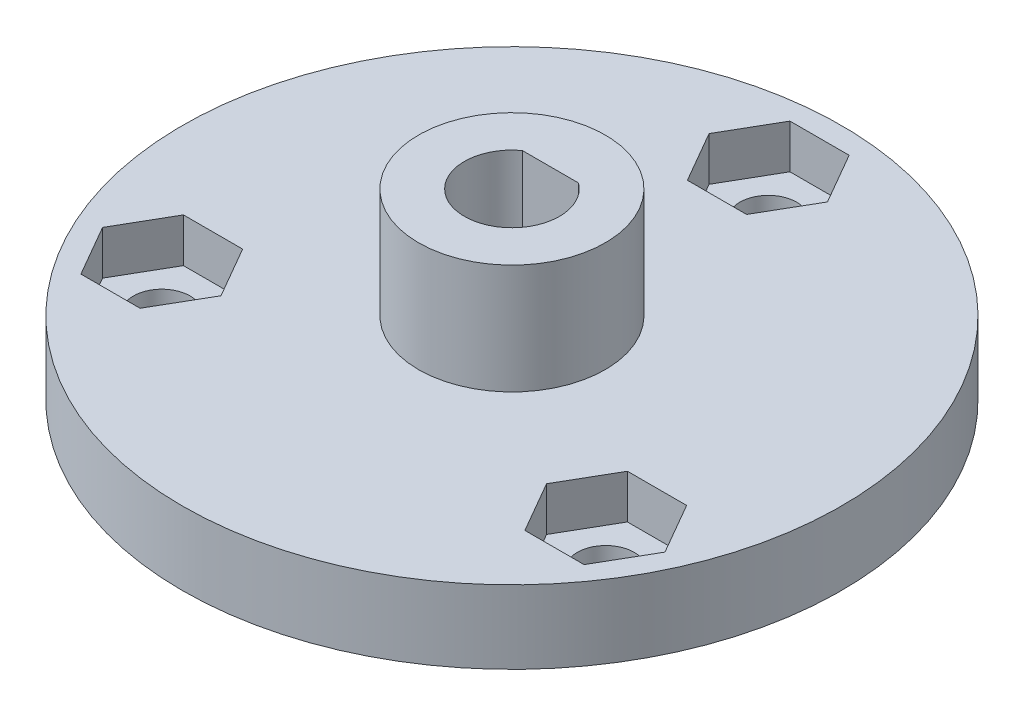
ISO-10303-21;
HEADER;
FILE_DESCRIPTION(('STEP AP214'),'2;1');
FILE_NAME('part.step','',(''),(''),'','','');
FILE_SCHEMA(('AUTOMOTIVE_DESIGN { 1 0 10303 214 1 1 1 1 }'));
ENDSEC;
DATA;
#1=APPLICATION_CONTEXT('core data for automotive mechanical design processes');
#2=APPLICATION_PROTOCOL_DEFINITION('international standard','automotive_design',2000,#1);
#3=PRODUCT_CONTEXT('',#1,'mechanical');
#4=PRODUCT('Part','Part','',(#3));
#5=PRODUCT_RELATED_PRODUCT_CATEGORY('part','',(#4));
#6=PRODUCT_DEFINITION_FORMATION('','',#4);
#7=PRODUCT_DEFINITION_CONTEXT('part definition',#1,'design');
#8=PRODUCT_DEFINITION('design','',#6,#7);
#9=PRODUCT_DEFINITION_SHAPE('','',#8);
#10=(LENGTH_UNIT() NAMED_UNIT(*) SI_UNIT(.MILLI.,.METRE.));
#11=(NAMED_UNIT(*) PLANE_ANGLE_UNIT() SI_UNIT($,.RADIAN.));
#12=(NAMED_UNIT(*) SI_UNIT($,.STERADIAN.) SOLID_ANGLE_UNIT());
#13=UNCERTAINTY_MEASURE_WITH_UNIT(LENGTH_MEASURE(1.E-05),#10,'distance_accuracy_value','');
#14=(GEOMETRIC_REPRESENTATION_CONTEXT(3) GLOBAL_UNCERTAINTY_ASSIGNED_CONTEXT((#13)) GLOBAL_UNIT_ASSIGNED_CONTEXT((#10,
#11,#12)) REPRESENTATION_CONTEXT('',''));
#15=CARTESIAN_POINT('',(0.,0.,0.));
#16=DIRECTION('',(0.,0.,1.));
#17=DIRECTION('',(1.,0.,0.));
#18=AXIS2_PLACEMENT_3D('',#15,#16,#17);
#19=CARTESIAN_POINT('',(0.,4.,0.));
#20=DIRECTION('',(0.,1.,0.));
#21=DIRECTION('',(0.,0.,1.));
#22=AXIS2_PLACEMENT_3D('',#19,#20,#21);
#23=PLANE('',#22);
#24=DIRECTION('',(1.,0.,0.));
#25=VECTOR('',#24,1.);
#26=CARTESIAN_POINT('',(-13.7409364067131,4.,4.20000000000006));
#27=LINE('',#26,#25);
#28=CARTESIAN_POINT('',(-13.7409364067131,4.,4.20000000000006));
#29=VERTEX_POINT('',#28);
#30=CARTESIAN_POINT('',(-10.5077748992512,4.,4.20000000000006));
#31=VERTEX_POINT('',#30);
#32=EDGE_CURVE('E226',#29,#31,#27,.T.);
#33=ORIENTED_EDGE('',*,*,#32,.T.);
#34=DIRECTION('',(0.499999999999999,0.,0.866025403784439));
#35=VECTOR('',#34,1.);
#36=CARTESIAN_POINT('',(-10.5077748992512,4.,4.20000000000006));
#37=LINE('',#36,#35);
#38=CARTESIAN_POINT('',(-8.8911941455202,4.,7.00000000000006));
#39=VERTEX_POINT('',#38);
#40=EDGE_CURVE('E63',#31,#39,#37,.T.);
#41=ORIENTED_EDGE('',*,*,#40,.T.);
#42=DIRECTION('',(-0.5,0.,0.866025403784438));
#43=VECTOR('',#42,1.);
#44=CARTESIAN_POINT('',(-8.8911941455202,4.,7.00000000000006));
#45=LINE('',#44,#43);
#46=CARTESIAN_POINT('',(-10.5077748992512,4.,9.80000000000006));
#47=VERTEX_POINT('',#46);
#48=EDGE_CURVE('E244',#39,#47,#45,.T.);
#49=ORIENTED_EDGE('',*,*,#48,.T.);
#50=DIRECTION('',(-1.,0.,0.));
#51=VECTOR('',#50,1.);
#52=CARTESIAN_POINT('',(-10.5077748992512,4.,9.80000000000006));
#53=LINE('',#52,#51);
#54=CARTESIAN_POINT('',(-13.7409364067131,4.,9.80000000000006));
#55=VERTEX_POINT('',#54);
#56=EDGE_CURVE('E248',#47,#55,#53,.T.);
#57=ORIENTED_EDGE('',*,*,#56,.T.);
#58=DIRECTION('',(-0.499999999999999,0.,-0.866025403784439));
#59=VECTOR('',#58,1.);
#60=CARTESIAN_POINT('',(-13.7409364067131,4.,9.80000000000006));
#61=LINE('',#60,#59);
#62=CARTESIAN_POINT('',(-15.357517160444,4.,7.00000000000006));
#63=VERTEX_POINT('',#62);
#64=EDGE_CURVE('E252',#55,#63,#61,.T.);
#65=ORIENTED_EDGE('',*,*,#64,.T.);
#66=DIRECTION('',(0.5,0.,-0.866025403784439));
#67=VECTOR('',#66,1.);
#68=CARTESIAN_POINT('',(-15.357517160444,4.,7.00000000000006));
#69=LINE('',#68,#67);
#70=EDGE_CURVE('E256',#63,#29,#69,.T.);
#71=ORIENTED_EDGE('',*,*,#70,.T.);
#72=EDGE_LOOP('',(#33,#41,#49,#57,#65,#71));
#73=FACE_BOUND('',#72,.T.);
#74=CARTESIAN_POINT('',(0.,4.,0.));
#75=DIRECTION('',(0.,1.,0.));
#76=DIRECTION('',(0.,0.,1.));
#77=AXIS2_PLACEMENT_3D('',#74,#75,#76);
#78=CIRCLE('',#77,5.1);
#79=CARTESIAN_POINT('',(0.,4.,5.1));
#80=VERTEX_POINT('',#79);
#81=EDGE_CURVE('E350',#80,#80,#78,.T.);
#82=ORIENTED_EDGE('',*,*,#81,.F.);
#83=EDGE_LOOP('',(#82));
#84=FACE_BOUND('',#83,.T.);
#85=CARTESIAN_POINT('',(0.,4.,0.));
#86=DIRECTION('',(0.,1.,0.));
#87=DIRECTION('',(0.,0.,1.));
#88=AXIS2_PLACEMENT_3D('',#85,#86,#87);
#89=CIRCLE('',#88,18.);
#90=CARTESIAN_POINT('',(0.,4.,18.));
#91=VERTEX_POINT('',#90);
#92=EDGE_CURVE('E11',#91,#91,#89,.T.);
#93=ORIENTED_EDGE('',*,*,#92,.T.);
#94=EDGE_LOOP('',(#93));
#95=FACE_BOUND('',#94,.T.);
#96=DIRECTION('',(-0.5,0.,-0.866025403784439));
#97=VECTOR('',#96,1.);
#98=CARTESIAN_POINT('',(10.5077748992512,4.,9.79999999999994));
#99=LINE('',#98,#97);
#100=CARTESIAN_POINT('',(10.5077748992512,4.,9.79999999999994));
#101=VERTEX_POINT('',#100);
#102=CARTESIAN_POINT('',(8.89119414552027,4.,6.99999999999994));
#103=VERTEX_POINT('',#102);
#104=EDGE_CURVE('E291',#101,#103,#99,.T.);
#105=ORIENTED_EDGE('',*,*,#104,.T.);
#106=DIRECTION('',(0.500000000000001,0.,-0.866025403784438));
#107=VECTOR('',#106,1.);
#108=CARTESIAN_POINT('',(8.89119414552027,4.,6.99999999999994));
#109=LINE('',#108,#107);
#110=CARTESIAN_POINT('',(10.5077748992512,4.,4.19999999999994));
#111=VERTEX_POINT('',#110);
#112=EDGE_CURVE('E285',#103,#111,#109,.T.);
#113=ORIENTED_EDGE('',*,*,#112,.T.);
#114=DIRECTION('',(1.,0.,0.));
#115=VECTOR('',#114,1.);
#116=CARTESIAN_POINT('',(10.5077748992512,4.,4.19999999999994));
#117=LINE('',#116,#115);
#118=CARTESIAN_POINT('',(13.7409364067131,4.,4.19999999999995));
#119=VERTEX_POINT('',#118);
#120=EDGE_CURVE('E310',#111,#119,#117,.T.);
#121=ORIENTED_EDGE('',*,*,#120,.T.);
#122=DIRECTION('',(0.499999999999999,0.,0.866025403784439));
#123=VECTOR('',#122,1.);
#124=CARTESIAN_POINT('',(13.7409364067131,4.,4.19999999999995));
#125=LINE('',#124,#123);
#126=CARTESIAN_POINT('',(15.3575171604441,4.,6.99999999999995));
#127=VERTEX_POINT('',#126);
#128=EDGE_CURVE('E314',#119,#127,#125,.T.);
#129=ORIENTED_EDGE('',*,*,#128,.T.);
#130=DIRECTION('',(-0.500000000000001,0.,0.866025403784438));
#131=VECTOR('',#130,1.);
#132=CARTESIAN_POINT('',(15.3575171604441,4.,6.99999999999995));
#133=LINE('',#132,#131);
#134=CARTESIAN_POINT('',(13.7409364067131,4.,9.79999999999995));
#135=VERTEX_POINT('',#134);
#136=EDGE_CURVE('E318',#127,#135,#133,.T.);
#137=ORIENTED_EDGE('',*,*,#136,.T.);
#138=DIRECTION('',(-1.,0.,0.));
#139=VECTOR('',#138,1.);
#140=CARTESIAN_POINT('',(13.7409364067131,4.,9.79999999999995));
#141=LINE('',#140,#139);
#142=EDGE_CURVE('E322',#135,#101,#141,.T.);
#143=ORIENTED_EDGE('',*,*,#142,.T.);
#144=EDGE_LOOP('',(#105,#113,#121,#129,#137,#143));
#145=FACE_BOUND('',#144,.T.);
#146=DIRECTION('',(-0.5,0.,0.866025403784438));
#147=VECTOR('',#146,1.);
#148=CARTESIAN_POINT('',(3.23316150746183,4.,-14.));
#149=LINE('',#148,#147);
#150=CARTESIAN_POINT('',(3.23316150746183,4.,-14.));
#151=VERTEX_POINT('',#150);
#152=CARTESIAN_POINT('',(1.61658075373088,4.,-11.2));
#153=VERTEX_POINT('',#152);
#154=EDGE_CURVE('E198',#151,#153,#149,.T.);
#155=ORIENTED_EDGE('',*,*,#154,.T.);
#156=DIRECTION('',(-1.,0.,0.));
#157=VECTOR('',#156,1.);
#158=CARTESIAN_POINT('',(1.61658075373088,4.,-11.2));
#159=LINE('',#158,#157);
#160=CARTESIAN_POINT('',(-1.61658075373102,4.,-11.2));
#161=VERTEX_POINT('',#160);
#162=EDGE_CURVE('E55',#153,#161,#159,.T.);
#163=ORIENTED_EDGE('',*,*,#162,.T.);
#164=DIRECTION('',(-0.5,0.,-0.866025403784439));
#165=VECTOR('',#164,1.);
#166=CARTESIAN_POINT('',(-1.61658075373102,4.,-11.2));
#167=LINE('',#166,#165);
#168=CARTESIAN_POINT('',(-3.23316150746197,4.,-14.));
#169=VERTEX_POINT('',#168);
#170=EDGE_CURVE('E202',#161,#169,#167,.T.);
#171=ORIENTED_EDGE('',*,*,#170,.T.);
#172=DIRECTION('',(0.5,0.,-0.866025403784439));
#173=VECTOR('',#172,1.);
#174=CARTESIAN_POINT('',(-3.23316150746197,4.,-14.));
#175=LINE('',#174,#173);
#176=CARTESIAN_POINT('',(-1.61658075373102,4.,-16.8));
#177=VERTEX_POINT('',#176);
#178=EDGE_CURVE('E751',#169,#177,#175,.T.);
#179=ORIENTED_EDGE('',*,*,#178,.T.);
#180=DIRECTION('',(1.,0.,0.));
#181=VECTOR('',#180,1.);
#182=CARTESIAN_POINT('',(-1.61658075373102,4.,-16.8));
#183=LINE('',#182,#181);
#184=CARTESIAN_POINT('',(1.61658075373088,4.,-16.8));
#185=VERTEX_POINT('',#184);
#186=EDGE_CURVE('E746',#177,#185,#183,.T.);
#187=ORIENTED_EDGE('',*,*,#186,.T.);
#188=DIRECTION('',(0.5,0.,0.866025403784439));
#189=VECTOR('',#188,1.);
#190=CARTESIAN_POINT('',(1.61658075373088,4.,-16.8));
#191=LINE('',#190,#189);
#192=EDGE_CURVE('E736',#185,#151,#191,.T.);
#193=ORIENTED_EDGE('',*,*,#192,.T.);
#194=EDGE_LOOP('',(#155,#163,#171,#179,#187,#193));
#195=FACE_BOUND('',#194,.T.);
#196=ADVANCED_FACE('F39',(#73,#84,#95,#145,#195),#23,.T.);
#197=CARTESIAN_POINT('',(0.,0.,0.));
#198=DIRECTION('',(0.,1.,0.));
#199=DIRECTION('',(0.,0.,1.));
#200=AXIS2_PLACEMENT_3D('',#197,#198,#199);
#201=PLANE('',#200);
#202=CARTESIAN_POINT('',(0.,0.,0.));
#203=DIRECTION('',(0.,-1.,0.));
#204=DIRECTION('',(0.,0.,-1.));
#205=AXIS2_PLACEMENT_3D('',#202,#203,#204);
#206=CIRCLE('',#205,2.6);
#207=CARTESIAN_POINT('',(0.,0.,-2.6));
#208=VERTEX_POINT('',#207);
#209=EDGE_CURVE('E366',#208,#208,#206,.T.);
#210=ORIENTED_EDGE('',*,*,#209,.F.);
#211=EDGE_LOOP('',(#210));
#212=FACE_BOUND('',#211,.T.);
#213=CARTESIAN_POINT('',(0.,0.,0.));
#214=DIRECTION('',(0.,1.,0.));
#215=DIRECTION('',(0.,0.,1.));
#216=AXIS2_PLACEMENT_3D('',#213,#214,#215);
#217=CIRCLE('',#216,18.);
#218=CARTESIAN_POINT('',(0.,0.,18.));
#219=VERTEX_POINT('',#218);
#220=EDGE_CURVE('E43',#219,#219,#217,.T.);
#221=ORIENTED_EDGE('',*,*,#220,.F.);
#222=EDGE_LOOP('',(#221));
#223=FACE_BOUND('',#222,.T.);
#224=CARTESIAN_POINT('',(-12.1243556529821,0.,7.00000000000006));
#225=DIRECTION('',(0.,1.,0.));
#226=DIRECTION('',(0.,0.,1.));
#227=AXIS2_PLACEMENT_3D('',#224,#225,#226);
#228=CIRCLE('',#227,1.55);
#229=CARTESIAN_POINT('',(-12.1243556529821,0.,8.55000000000006));
#230=VERTEX_POINT('',#229);
#231=EDGE_CURVE('E384',#230,#230,#228,.T.);
#232=ORIENTED_EDGE('',*,*,#231,.T.);
#233=EDGE_LOOP('',(#232));
#234=FACE_BOUND('',#233,.T.);
#235=CARTESIAN_POINT('',(0.,0.,-14.));
#236=DIRECTION('',(0.,1.,0.));
#237=DIRECTION('',(0.,0.,1.));
#238=AXIS2_PLACEMENT_3D('',#235,#236,#237);
#239=CIRCLE('',#238,1.55);
#240=CARTESIAN_POINT('',(0.,0.,-12.45));
#241=VERTEX_POINT('',#240);
#242=EDGE_CURVE('E380',#241,#241,#239,.T.);
#243=ORIENTED_EDGE('',*,*,#242,.T.);
#244=EDGE_LOOP('',(#243));
#245=FACE_BOUND('',#244,.T.);
#246=CARTESIAN_POINT('',(12.1243556529822,0.,6.99999999999994));
#247=DIRECTION('',(0.,1.,0.));
#248=DIRECTION('',(0.,0.,1.));
#249=AXIS2_PLACEMENT_3D('',#246,#247,#248);
#250=CIRCLE('',#249,1.55);
#251=CARTESIAN_POINT('',(12.1243556529822,0.,8.54999999999994));
#252=VERTEX_POINT('',#251);
#253=EDGE_CURVE('E373',#252,#252,#250,.T.);
#254=ORIENTED_EDGE('',*,*,#253,.T.);
#255=EDGE_LOOP('',(#254));
#256=FACE_BOUND('',#255,.T.);
#257=ADVANCED_FACE('F394',(#212,#223,#234,#245,#256),#201,.F.);
#258=CARTESIAN_POINT('',(0.,4.,0.));
#259=DIRECTION('',(0.,-1.,0.));
#260=DIRECTION('',(0.,0.,-1.));
#261=AXIS2_PLACEMENT_3D('',#258,#259,#260);
#262=CYLINDRICAL_SURFACE('',#261,18.);
#263=ORIENTED_EDGE('',*,*,#92,.F.);
#264=EDGE_LOOP('',(#263));
#265=FACE_BOUND('',#264,.T.);
#266=ORIENTED_EDGE('',*,*,#220,.T.);
#267=EDGE_LOOP('',(#266));
#268=FACE_BOUND('',#267,.T.);
#269=ADVANCED_FACE('F41',(#265,#268),#262,.T.);
#270=CARTESIAN_POINT('',(-12.1243556529821,4.,7.00000000000006));
#271=DIRECTION('',(0.,-1.,0.));
#272=DIRECTION('',(0.,0.,-1.));
#273=AXIS2_PLACEMENT_3D('',#270,#271,#272);
#274=CYLINDRICAL_SURFACE('',#273,1.55);
#275=CARTESIAN_POINT('',(-12.1243556529821,1.6,7.00000000000006));
#276=DIRECTION('',(0.,-1.,0.));
#277=DIRECTION('',(0.,0.,-1.));
#278=AXIS2_PLACEMENT_3D('',#275,#276,#277);
#279=CIRCLE('',#278,1.55);
#280=CARTESIAN_POINT('',(-12.1243556529821,1.6,5.45000000000006));
#281=VERTEX_POINT('',#280);
#282=EDGE_CURVE('E216',#281,#281,#279,.T.);
#283=ORIENTED_EDGE('',*,*,#282,.F.);
#284=EDGE_LOOP('',(#283));
#285=FACE_BOUND('',#284,.T.);
#286=ORIENTED_EDGE('',*,*,#231,.F.);
#287=EDGE_LOOP('',(#286));
#288=FACE_BOUND('',#287,.T.);
#289=ADVANCED_FACE('F415',(#285,#288),#274,.F.);
#290=CARTESIAN_POINT('',(0.,4.,-14.));
#291=DIRECTION('',(0.,-1.,0.));
#292=DIRECTION('',(0.,0.,-1.));
#293=AXIS2_PLACEMENT_3D('',#290,#291,#292);
#294=CYLINDRICAL_SURFACE('',#293,1.55);
#295=CARTESIAN_POINT('',(0.,1.6,-14.));
#296=DIRECTION('',(0.,-1.,0.));
#297=DIRECTION('',(0.,0.,-1.));
#298=AXIS2_PLACEMENT_3D('',#295,#296,#297);
#299=CIRCLE('',#298,1.55);
#300=CARTESIAN_POINT('',(0.,1.6,-15.55));
#301=VERTEX_POINT('',#300);
#302=EDGE_CURVE('E280',#301,#301,#299,.T.);
#303=ORIENTED_EDGE('',*,*,#302,.F.);
#304=EDGE_LOOP('',(#303));
#305=FACE_BOUND('',#304,.T.);
#306=ORIENTED_EDGE('',*,*,#242,.F.);
#307=EDGE_LOOP('',(#306));
#308=FACE_BOUND('',#307,.T.);
#309=ADVANCED_FACE('F405',(#305,#308),#294,.F.);
#310=CARTESIAN_POINT('',(12.1243556529822,4.,6.99999999999994));
#311=DIRECTION('',(0.,-1.,0.));
#312=DIRECTION('',(0.,0.,-1.));
#313=AXIS2_PLACEMENT_3D('',#310,#311,#312);
#314=CYLINDRICAL_SURFACE('',#313,1.55);
#315=CARTESIAN_POINT('',(12.1243556529822,1.6,6.99999999999994));
#316=DIRECTION('',(0.,-1.,0.));
#317=DIRECTION('',(0.,0.,-1.));
#318=AXIS2_PLACEMENT_3D('',#315,#316,#317);
#319=CIRCLE('',#318,1.55);
#320=CARTESIAN_POINT('',(12.1243556529822,1.6,5.44999999999993));
#321=VERTEX_POINT('',#320);
#322=EDGE_CURVE('E281',#321,#321,#319,.T.);
#323=ORIENTED_EDGE('',*,*,#322,.F.);
#324=EDGE_LOOP('',(#323));
#325=FACE_BOUND('',#324,.T.);
#326=ORIENTED_EDGE('',*,*,#253,.F.);
#327=EDGE_LOOP('',(#326));
#328=FACE_BOUND('',#327,.T.);
#329=ADVANCED_FACE('F402',(#325,#328),#314,.F.);
#330=CARTESIAN_POINT('',(0.,2.,0.));
#331=DIRECTION('',(0.,-1.,0.));
#332=DIRECTION('',(0.,0.,-1.));
#333=AXIS2_PLACEMENT_3D('',#330,#331,#332);
#334=CYLINDRICAL_SURFACE('',#333,2.6);
#335=CARTESIAN_POINT('',(0.,2.,0.));
#336=DIRECTION('',(0.,-1.,0.));
#337=DIRECTION('',(0.,0.,-1.));
#338=AXIS2_PLACEMENT_3D('',#335,#336,#337);
#339=CIRCLE('',#338,2.6);
#340=CARTESIAN_POINT('',(-1.53297097167559,2.,-2.1));
#341=VERTEX_POINT('',#340);
#342=CARTESIAN_POINT('',(1.53297097167559,2.,-2.1));
#343=VERTEX_POINT('',#342);
#344=EDGE_CURVE('E369',#341,#343,#339,.T.);
#345=ORIENTED_EDGE('',*,*,#344,.F.);
#346=DIRECTION('',(0.,-1.,0.));
#347=VECTOR('',#346,1.);
#348=CARTESIAN_POINT('',(-1.53297097167559,4.,-2.1));
#349=LINE('',#348,#347);
#350=CARTESIAN_POINT('',(-1.53297097167559,10.,-2.1));
#351=VERTEX_POINT('',#350);
#352=EDGE_CURVE('E362',#351,#341,#349,.T.);
#353=ORIENTED_EDGE('',*,*,#352,.F.);
#354=CARTESIAN_POINT('',(0.,10.,0.));
#355=DIRECTION('',(0.,1.,0.));
#356=DIRECTION('',(0.,0.,1.));
#357=AXIS2_PLACEMENT_3D('',#354,#355,#356);
#358=CIRCLE('',#357,2.6);
#359=CARTESIAN_POINT('',(1.53297097167559,10.,-2.1));
#360=VERTEX_POINT('',#359);
#361=EDGE_CURVE('E204',#351,#360,#358,.T.);
#362=ORIENTED_EDGE('',*,*,#361,.T.);
#363=DIRECTION('',(0.,-1.,0.));
#364=VECTOR('',#363,1.);
#365=CARTESIAN_POINT('',(1.53297097167559,4.,-2.1));
#366=LINE('',#365,#364);
#367=EDGE_CURVE('E363',#360,#343,#366,.T.);
#368=ORIENTED_EDGE('',*,*,#367,.T.);
#369=EDGE_LOOP('',(#345,#353,#362,#368));
#370=FACE_BOUND('',#369,.T.);
#371=ORIENTED_EDGE('',*,*,#209,.T.);
#372=EDGE_LOOP('',(#371));
#373=FACE_BOUND('',#372,.T.);
#374=ADVANCED_FACE('F404',(#370,#373),#334,.F.);
#375=CARTESIAN_POINT('',(0.,2.,0.));
#376=DIRECTION('',(0.,-1.,0.));
#377=DIRECTION('',(0.,0.,-1.));
#378=AXIS2_PLACEMENT_3D('',#375,#376,#377);
#379=PLANE('',#378);
#380=DIRECTION('',(1.,0.,0.));
#381=VECTOR('',#380,1.);
#382=CARTESIAN_POINT('',(0.,2.,-2.1));
#383=LINE('',#382,#381);
#384=EDGE_CURVE('E355',#341,#343,#383,.T.);
#385=ORIENTED_EDGE('',*,*,#384,.F.);
#386=ORIENTED_EDGE('',*,*,#344,.T.);
#387=EDGE_LOOP('',(#385,#386));
#388=FACE_BOUND('',#387,.T.);
#389=ADVANCED_FACE('F412',(#388),#379,.T.);
#390=CARTESIAN_POINT('',(0.,4.,-2.1));
#391=DIRECTION('',(0.,0.,-1.));
#392=DIRECTION('',(-1.,0.,0.));
#393=AXIS2_PLACEMENT_3D('',#390,#391,#392);
#394=PLANE('',#393);
#395=ORIENTED_EDGE('',*,*,#384,.T.);
#396=ORIENTED_EDGE('',*,*,#367,.F.);
#397=DIRECTION('',(-1.,0.,0.));
#398=VECTOR('',#397,1.);
#399=CARTESIAN_POINT('',(-1.53297097167559,10.,-2.1));
#400=LINE('',#399,#398);
#401=EDGE_CURVE('E210',#360,#351,#400,.T.);
#402=ORIENTED_EDGE('',*,*,#401,.T.);
#403=ORIENTED_EDGE('',*,*,#352,.T.);
#404=EDGE_LOOP('',(#395,#396,#402,#403));
#405=FACE_BOUND('',#404,.T.);
#406=ADVANCED_FACE('F505',(#405),#394,.F.);
#407=CARTESIAN_POINT('',(0.,10.,0.));
#408=DIRECTION('',(0.,1.,0.));
#409=DIRECTION('',(0.,0.,1.));
#410=AXIS2_PLACEMENT_3D('',#407,#408,#409);
#411=PLANE('',#410);
#412=CARTESIAN_POINT('',(0.,10.,0.));
#413=DIRECTION('',(0.,1.,0.));
#414=DIRECTION('',(0.,0.,1.));
#415=AXIS2_PLACEMENT_3D('',#412,#413,#414);
#416=CIRCLE('',#415,5.1);
#417=CARTESIAN_POINT('',(0.,10.,5.1));
#418=VERTEX_POINT('',#417);
#419=EDGE_CURVE('E351',#418,#418,#416,.T.);
#420=ORIENTED_EDGE('',*,*,#419,.T.);
#421=EDGE_LOOP('',(#420));
#422=FACE_BOUND('',#421,.T.);
#423=ORIENTED_EDGE('',*,*,#401,.F.);
#424=ORIENTED_EDGE('',*,*,#361,.F.);
#425=EDGE_LOOP('',(#423,#424));
#426=FACE_BOUND('',#425,.T.);
#427=ADVANCED_FACE('F502',(#422,#426),#411,.T.);
#428=CARTESIAN_POINT('',(0.,10.,0.));
#429=DIRECTION('',(0.,-1.,0.));
#430=DIRECTION('',(0.,0.,-1.));
#431=AXIS2_PLACEMENT_3D('',#428,#429,#430);
#432=CYLINDRICAL_SURFACE('',#431,5.1);
#433=ORIENTED_EDGE('',*,*,#419,.F.);
#434=EDGE_LOOP('',(#433));
#435=FACE_BOUND('',#434,.T.);
#436=ORIENTED_EDGE('',*,*,#81,.T.);
#437=EDGE_LOOP('',(#436));
#438=FACE_BOUND('',#437,.T.);
#439=ADVANCED_FACE('F477',(#435,#438),#432,.T.);
#440=CARTESIAN_POINT('',(0.,1.6,0.));
#441=DIRECTION('',(0.,-1.,0.));
#442=DIRECTION('',(0.,0.,-1.));
#443=AXIS2_PLACEMENT_3D('',#440,#441,#442);
#444=PLANE('',#443);
#445=DIRECTION('',(0.500000000000001,0.,-0.866025403784438));
#446=VECTOR('',#445,1.);
#447=CARTESIAN_POINT('',(8.89119414552027,1.6,6.99999999999994));
#448=LINE('',#447,#446);
#449=CARTESIAN_POINT('',(8.89119414552027,1.6,6.99999999999994));
#450=VERTEX_POINT('',#449);
#451=CARTESIAN_POINT('',(10.5077748992512,1.6,4.19999999999994));
#452=VERTEX_POINT('',#451);
#453=EDGE_CURVE('E286',#450,#452,#448,.T.);
#454=ORIENTED_EDGE('',*,*,#453,.F.);
#455=DIRECTION('',(-0.5,0.,-0.866025403784439));
#456=VECTOR('',#455,1.);
#457=CARTESIAN_POINT('',(10.5077748992512,1.6,9.79999999999994));
#458=LINE('',#457,#456);
#459=CARTESIAN_POINT('',(10.5077748992512,1.6,9.79999999999994));
#460=VERTEX_POINT('',#459);
#461=EDGE_CURVE('E303',#460,#450,#458,.T.);
#462=ORIENTED_EDGE('',*,*,#461,.F.);
#463=DIRECTION('',(-1.,0.,0.));
#464=VECTOR('',#463,1.);
#465=CARTESIAN_POINT('',(13.7409364067131,1.6,9.79999999999995));
#466=LINE('',#465,#464);
#467=CARTESIAN_POINT('',(13.7409364067131,1.6,9.79999999999995));
#468=VERTEX_POINT('',#467);
#469=EDGE_CURVE('E300',#468,#460,#466,.T.);
#470=ORIENTED_EDGE('',*,*,#469,.F.);
#471=DIRECTION('',(-0.500000000000001,0.,0.866025403784438));
#472=VECTOR('',#471,1.);
#473=CARTESIAN_POINT('',(15.3575171604441,1.6,6.99999999999995));
#474=LINE('',#473,#472);
#475=CARTESIAN_POINT('',(15.3575171604441,1.6,6.99999999999995));
#476=VERTEX_POINT('',#475);
#477=EDGE_CURVE('E297',#476,#468,#474,.T.);
#478=ORIENTED_EDGE('',*,*,#477,.F.);
#479=DIRECTION('',(0.499999999999999,0.,0.866025403784439));
#480=VECTOR('',#479,1.);
#481=CARTESIAN_POINT('',(13.7409364067131,1.6,4.19999999999995));
#482=LINE('',#481,#480);
#483=CARTESIAN_POINT('',(13.7409364067131,1.6,4.19999999999995));
#484=VERTEX_POINT('',#483);
#485=EDGE_CURVE('E294',#484,#476,#482,.T.);
#486=ORIENTED_EDGE('',*,*,#485,.F.);
#487=DIRECTION('',(1.,0.,0.));
#488=VECTOR('',#487,1.);
#489=CARTESIAN_POINT('',(10.5077748992512,1.6,4.19999999999994));
#490=LINE('',#489,#488);
#491=EDGE_CURVE('E290',#452,#484,#490,.T.);
#492=ORIENTED_EDGE('',*,*,#491,.F.);
#493=EDGE_LOOP('',(#454,#462,#470,#478,#486,#492));
#494=FACE_BOUND('',#493,.T.);
#495=ORIENTED_EDGE('',*,*,#322,.T.);
#496=EDGE_LOOP('',(#495));
#497=FACE_BOUND('',#496,.T.);
#498=ADVANCED_FACE('F473',(#494,#497),#444,.F.);
#499=CARTESIAN_POINT('',(8.89119414552027,1.6,6.99999999999994));
#500=DIRECTION('',(0.866025403784438,0.,0.500000000000001));
#501=DIRECTION('',(0.500000000000001,0.,-0.866025403784438));
#502=AXIS2_PLACEMENT_3D('',#499,#500,#501);
#503=PLANE('',#502);
#504=ORIENTED_EDGE('',*,*,#112,.F.);
#505=DIRECTION('',(0.,1.,0.));
#506=VECTOR('',#505,1.);
#507=CARTESIAN_POINT('',(8.89119414552027,1.6,6.99999999999994));
#508=LINE('',#507,#506);
#509=EDGE_CURVE('E306',#450,#103,#508,.T.);
#510=ORIENTED_EDGE('',*,*,#509,.F.);
#511=ORIENTED_EDGE('',*,*,#453,.T.);
#512=DIRECTION('',(0.,1.,0.));
#513=VECTOR('',#512,1.);
#514=CARTESIAN_POINT('',(10.5077748992512,1.6,4.19999999999994));
#515=LINE('',#514,#513);
#516=EDGE_CURVE('E220',#452,#111,#515,.T.);
#517=ORIENTED_EDGE('',*,*,#516,.T.);
#518=EDGE_LOOP('',(#504,#510,#511,#517));
#519=FACE_BOUND('',#518,.T.);
#520=ADVANCED_FACE('F476',(#519),#503,.T.);
#521=CARTESIAN_POINT('',(10.5077748992512,1.6,4.19999999999994));
#522=DIRECTION('',(0.,0.,1.));
#523=DIRECTION('',(1.,0.,0.));
#524=AXIS2_PLACEMENT_3D('',#521,#522,#523);
#525=PLANE('',#524);
#526=ORIENTED_EDGE('',*,*,#120,.F.);
#527=ORIENTED_EDGE('',*,*,#516,.F.);
#528=ORIENTED_EDGE('',*,*,#491,.T.);
#529=DIRECTION('',(0.,1.,0.));
#530=VECTOR('',#529,1.);
#531=CARTESIAN_POINT('',(13.7409364067131,1.6,4.19999999999995));
#532=LINE('',#531,#530);
#533=EDGE_CURVE('E341',#484,#119,#532,.T.);
#534=ORIENTED_EDGE('',*,*,#533,.T.);
#535=EDGE_LOOP('',(#526,#527,#528,#534));
#536=FACE_BOUND('',#535,.T.);
#537=ADVANCED_FACE('F494',(#536),#525,.T.);
#538=CARTESIAN_POINT('',(13.7409364067131,1.6,4.19999999999995));
#539=DIRECTION('',(-0.866025403784439,0.,0.499999999999999));
#540=DIRECTION('',(0.5,0.,0.866025403784439));
#541=AXIS2_PLACEMENT_3D('',#538,#539,#540);
#542=PLANE('',#541);
#543=ORIENTED_EDGE('',*,*,#128,.F.);
#544=ORIENTED_EDGE('',*,*,#533,.F.);
#545=ORIENTED_EDGE('',*,*,#485,.T.);
#546=DIRECTION('',(0.,1.,0.));
#547=VECTOR('',#546,1.);
#548=CARTESIAN_POINT('',(15.3575171604441,1.6,6.99999999999995));
#549=LINE('',#548,#547);
#550=EDGE_CURVE('E338',#476,#127,#549,.T.);
#551=ORIENTED_EDGE('',*,*,#550,.T.);
#552=EDGE_LOOP('',(#543,#544,#545,#551));
#553=FACE_BOUND('',#552,.T.);
#554=ADVANCED_FACE('F490',(#553),#542,.T.);
#555=CARTESIAN_POINT('',(15.3575171604441,1.6,6.99999999999995));
#556=DIRECTION('',(-0.866025403784438,0.,-0.500000000000001));
#557=DIRECTION('',(-0.500000000000001,0.,0.866025403784438));
#558=AXIS2_PLACEMENT_3D('',#555,#556,#557);
#559=PLANE('',#558);
#560=ORIENTED_EDGE('',*,*,#136,.F.);
#561=ORIENTED_EDGE('',*,*,#550,.F.);
#562=ORIENTED_EDGE('',*,*,#477,.T.);
#563=DIRECTION('',(0.,1.,0.));
#564=VECTOR('',#563,1.);
#565=CARTESIAN_POINT('',(13.7409364067131,1.6,9.79999999999995));
#566=LINE('',#565,#564);
#567=EDGE_CURVE('E335',#468,#135,#566,.T.);
#568=ORIENTED_EDGE('',*,*,#567,.T.);
#569=EDGE_LOOP('',(#560,#561,#562,#568));
#570=FACE_BOUND('',#569,.T.);
#571=ADVANCED_FACE('F486',(#570),#559,.T.);
#572=CARTESIAN_POINT('',(13.7409364067131,1.6,9.79999999999995));
#573=DIRECTION('',(0.,0.,-1.));
#574=DIRECTION('',(-1.,0.,0.));
#575=AXIS2_PLACEMENT_3D('',#572,#573,#574);
#576=PLANE('',#575);
#577=ORIENTED_EDGE('',*,*,#142,.F.);
#578=ORIENTED_EDGE('',*,*,#567,.F.);
#579=ORIENTED_EDGE('',*,*,#469,.T.);
#580=DIRECTION('',(0.,1.,0.));
#581=VECTOR('',#580,1.);
#582=CARTESIAN_POINT('',(10.5077748992512,1.6,9.79999999999994));
#583=LINE('',#582,#581);
#584=EDGE_CURVE('E332',#460,#101,#583,.T.);
#585=ORIENTED_EDGE('',*,*,#584,.T.);
#586=EDGE_LOOP('',(#577,#578,#579,#585));
#587=FACE_BOUND('',#586,.T.);
#588=ADVANCED_FACE('F482',(#587),#576,.T.);
#589=CARTESIAN_POINT('',(10.5077748992512,1.6,9.79999999999994));
#590=DIRECTION('',(0.866025403784439,0.,-0.499999999999999));
#591=DIRECTION('',(-0.5,0.,-0.866025403784439));
#592=AXIS2_PLACEMENT_3D('',#589,#590,#591);
#593=PLANE('',#592);
#594=ORIENTED_EDGE('',*,*,#104,.F.);
#595=ORIENTED_EDGE('',*,*,#584,.F.);
#596=ORIENTED_EDGE('',*,*,#461,.T.);
#597=ORIENTED_EDGE('',*,*,#509,.T.);
#598=EDGE_LOOP('',(#594,#595,#596,#597));
#599=FACE_BOUND('',#598,.T.);
#600=ADVANCED_FACE('F479',(#599),#593,.T.);
#601=CARTESIAN_POINT('',(0.,1.6,0.));
#602=DIRECTION('',(0.,-1.,0.));
#603=DIRECTION('',(0.,0.,-1.));
#604=AXIS2_PLACEMENT_3D('',#601,#602,#603);
#605=PLANE('',#604);
#606=DIRECTION('',(-1.,0.,0.));
#607=VECTOR('',#606,1.);
#608=CARTESIAN_POINT('',(1.61658075373088,1.6,-11.2));
#609=LINE('',#608,#607);
#610=CARTESIAN_POINT('',(1.61658075373088,1.6,-11.2));
#611=VERTEX_POINT('',#610);
#612=CARTESIAN_POINT('',(-1.61658075373102,1.6,-11.2));
#613=VERTEX_POINT('',#612);
#614=EDGE_CURVE('E186',#611,#613,#609,.T.);
#615=ORIENTED_EDGE('',*,*,#614,.F.);
#616=DIRECTION('',(-0.5,0.,0.866025403784438));
#617=VECTOR('',#616,1.);
#618=CARTESIAN_POINT('',(3.23316150746183,1.6,-14.));
#619=LINE('',#618,#617);
#620=CARTESIAN_POINT('',(3.23316150746183,1.6,-14.));
#621=VERTEX_POINT('',#620);
#622=EDGE_CURVE('E763',#621,#611,#619,.T.);
#623=ORIENTED_EDGE('',*,*,#622,.F.);
#624=DIRECTION('',(0.5,0.,0.866025403784439));
#625=VECTOR('',#624,1.);
#626=CARTESIAN_POINT('',(1.61658075373088,1.6,-16.8));
#627=LINE('',#626,#625);
#628=CARTESIAN_POINT('',(1.61658075373088,1.6,-16.8));
#629=VERTEX_POINT('',#628);
#630=EDGE_CURVE('E769',#629,#621,#627,.T.);
#631=ORIENTED_EDGE('',*,*,#630,.F.);
#632=DIRECTION('',(1.,0.,0.));
#633=VECTOR('',#632,1.);
#634=CARTESIAN_POINT('',(-1.61658075373102,1.6,-16.8));
#635=LINE('',#634,#633);
#636=CARTESIAN_POINT('',(-1.61658075373102,1.6,-16.8));
#637=VERTEX_POINT('',#636);
#638=EDGE_CURVE('E768',#637,#629,#635,.T.);
#639=ORIENTED_EDGE('',*,*,#638,.F.);
#640=DIRECTION('',(0.5,0.,-0.866025403784439));
#641=VECTOR('',#640,1.);
#642=CARTESIAN_POINT('',(-3.23316150746197,1.6,-14.));
#643=LINE('',#642,#641);
#644=CARTESIAN_POINT('',(-3.23316150746197,1.6,-14.));
#645=VERTEX_POINT('',#644);
#646=EDGE_CURVE('E188',#645,#637,#643,.T.);
#647=ORIENTED_EDGE('',*,*,#646,.F.);
#648=DIRECTION('',(-0.5,0.,-0.866025403784439));
#649=VECTOR('',#648,1.);
#650=CARTESIAN_POINT('',(-1.61658075373102,1.6,-11.2));
#651=LINE('',#650,#649);
#652=EDGE_CURVE('E181',#613,#645,#651,.T.);
#653=ORIENTED_EDGE('',*,*,#652,.F.);
#654=EDGE_LOOP('',(#615,#623,#631,#639,#647,#653));
#655=FACE_BOUND('',#654,.T.);
#656=ORIENTED_EDGE('',*,*,#302,.T.);
#657=EDGE_LOOP('',(#656));
#658=FACE_BOUND('',#657,.T.);
#659=ADVANCED_FACE('F183',(#655,#658),#605,.F.);
#660=CARTESIAN_POINT('',(1.61658075373088,1.6,-11.2));
#661=DIRECTION('',(0.,0.,-1.));
#662=DIRECTION('',(-1.,0.,0.));
#663=AXIS2_PLACEMENT_3D('',#660,#661,#662);
#664=PLANE('',#663);
#665=ORIENTED_EDGE('',*,*,#162,.F.);
#666=DIRECTION('',(0.,1.,0.));
#667=VECTOR('',#666,1.);
#668=CARTESIAN_POINT('',(1.61658075373088,1.6,-11.2));
#669=LINE('',#668,#667);
#670=EDGE_CURVE('E196',#611,#153,#669,.T.);
#671=ORIENTED_EDGE('',*,*,#670,.F.);
#672=ORIENTED_EDGE('',*,*,#614,.T.);
#673=DIRECTION('',(0.,1.,0.));
#674=VECTOR('',#673,1.);
#675=CARTESIAN_POINT('',(-1.61658075373102,1.6,-11.2));
#676=LINE('',#675,#674);
#677=EDGE_CURVE('E195',#613,#161,#676,.T.);
#678=ORIENTED_EDGE('',*,*,#677,.T.);
#679=EDGE_LOOP('',(#665,#671,#672,#678));
#680=FACE_BOUND('',#679,.T.);
#681=ADVANCED_FACE('F194',(#680),#664,.T.);
#682=CARTESIAN_POINT('',(-1.61658075373102,1.6,-11.2));
#683=DIRECTION('',(0.866025403784439,0.,-0.5));
#684=DIRECTION('',(-0.5,0.,-0.866025403784439));
#685=AXIS2_PLACEMENT_3D('',#682,#683,#684);
#686=PLANE('',#685);
#687=ORIENTED_EDGE('',*,*,#170,.F.);
#688=ORIENTED_EDGE('',*,*,#677,.F.);
#689=ORIENTED_EDGE('',*,*,#652,.T.);
#690=DIRECTION('',(0.,1.,0.));
#691=VECTOR('',#690,1.);
#692=CARTESIAN_POINT('',(-3.23316150746197,1.6,-14.));
#693=LINE('',#692,#691);
#694=EDGE_CURVE('E205',#645,#169,#693,.T.);
#695=ORIENTED_EDGE('',*,*,#694,.T.);
#696=EDGE_LOOP('',(#687,#688,#689,#695));
#697=FACE_BOUND('',#696,.T.);
#698=ADVANCED_FACE('F200',(#697),#686,.T.);
#699=CARTESIAN_POINT('',(-3.23316150746197,1.6,-14.));
#700=DIRECTION('',(0.866025403784439,0.,0.5));
#701=DIRECTION('',(0.5,0.,-0.866025403784439));
#702=AXIS2_PLACEMENT_3D('',#699,#700,#701);
#703=PLANE('',#702);
#704=ORIENTED_EDGE('',*,*,#178,.F.);
#705=ORIENTED_EDGE('',*,*,#694,.F.);
#706=ORIENTED_EDGE('',*,*,#646,.T.);
#707=DIRECTION('',(0.,1.,0.));
#708=VECTOR('',#707,1.);
#709=CARTESIAN_POINT('',(-1.61658075373102,1.6,-16.8));
#710=LINE('',#709,#708);
#711=EDGE_CURVE('E212',#637,#177,#710,.T.);
#712=ORIENTED_EDGE('',*,*,#711,.T.);
#713=EDGE_LOOP('',(#704,#705,#706,#712));
#714=FACE_BOUND('',#713,.T.);
#715=ADVANCED_FACE('F584',(#714),#703,.T.);
#716=CARTESIAN_POINT('',(-1.61658075373102,1.6,-16.8));
#717=DIRECTION('',(0.,0.,1.));
#718=DIRECTION('',(1.,0.,0.));
#719=AXIS2_PLACEMENT_3D('',#716,#717,#718);
#720=PLANE('',#719);
#721=ORIENTED_EDGE('',*,*,#186,.F.);
#722=ORIENTED_EDGE('',*,*,#711,.F.);
#723=ORIENTED_EDGE('',*,*,#638,.T.);
#724=DIRECTION('',(0.,1.,0.));
#725=VECTOR('',#724,1.);
#726=CARTESIAN_POINT('',(1.61658075373088,1.6,-16.8));
#727=LINE('',#726,#725);
#728=EDGE_CURVE('E738',#629,#185,#727,.T.);
#729=ORIENTED_EDGE('',*,*,#728,.T.);
#730=EDGE_LOOP('',(#721,#722,#723,#729));
#731=FACE_BOUND('',#730,.T.);
#732=ADVANCED_FACE('F590',(#731),#720,.T.);
#733=CARTESIAN_POINT('',(1.61658075373088,1.6,-16.8));
#734=DIRECTION('',(-0.866025403784439,0.,0.5));
#735=DIRECTION('',(0.5,0.,0.866025403784439));
#736=AXIS2_PLACEMENT_3D('',#733,#734,#735);
#737=PLANE('',#736);
#738=ORIENTED_EDGE('',*,*,#192,.F.);
#739=ORIENTED_EDGE('',*,*,#728,.F.);
#740=ORIENTED_EDGE('',*,*,#630,.T.);
#741=DIRECTION('',(0.,1.,0.));
#742=VECTOR('',#741,1.);
#743=CARTESIAN_POINT('',(3.23316150746183,1.6,-14.));
#744=LINE('',#743,#742);
#745=EDGE_CURVE('E741',#621,#151,#744,.T.);
#746=ORIENTED_EDGE('',*,*,#745,.T.);
#747=EDGE_LOOP('',(#738,#739,#740,#746));
#748=FACE_BOUND('',#747,.T.);
#749=ADVANCED_FACE('F447',(#748),#737,.T.);
#750=CARTESIAN_POINT('',(3.23316150746183,1.6,-14.));
#751=DIRECTION('',(-0.866025403784438,0.,-0.5));
#752=DIRECTION('',(-0.5,0.,0.866025403784439));
#753=AXIS2_PLACEMENT_3D('',#750,#751,#752);
#754=PLANE('',#753);
#755=ORIENTED_EDGE('',*,*,#154,.F.);
#756=ORIENTED_EDGE('',*,*,#745,.F.);
#757=ORIENTED_EDGE('',*,*,#622,.T.);
#758=ORIENTED_EDGE('',*,*,#670,.T.);
#759=EDGE_LOOP('',(#755,#756,#757,#758));
#760=FACE_BOUND('',#759,.T.);
#761=ADVANCED_FACE('F438',(#760),#754,.T.);
#762=CARTESIAN_POINT('',(0.,1.6,0.));
#763=DIRECTION('',(0.,-1.,0.));
#764=DIRECTION('',(0.,0.,-1.));
#765=AXIS2_PLACEMENT_3D('',#762,#763,#764);
#766=PLANE('',#765);
#767=DIRECTION('',(0.499999999999999,0.,0.866025403784439));
#768=VECTOR('',#767,1.);
#769=CARTESIAN_POINT('',(-10.5077748992512,1.6,4.20000000000006));
#770=LINE('',#769,#768);
#771=CARTESIAN_POINT('',(-10.5077748992512,1.6,4.20000000000006));
#772=VERTEX_POINT('',#771);
#773=CARTESIAN_POINT('',(-8.8911941455202,1.6,7.00000000000006));
#774=VERTEX_POINT('',#773);
#775=EDGE_CURVE('E221',#772,#774,#770,.T.);
#776=ORIENTED_EDGE('',*,*,#775,.F.);
#777=DIRECTION('',(1.,0.,0.));
#778=VECTOR('',#777,1.);
#779=CARTESIAN_POINT('',(-13.7409364067131,1.6,4.20000000000006));
#780=LINE('',#779,#778);
#781=CARTESIAN_POINT('',(-13.7409364067131,1.6,4.20000000000006));
#782=VERTEX_POINT('',#781);
#783=EDGE_CURVE('E238',#782,#772,#780,.T.);
#784=ORIENTED_EDGE('',*,*,#783,.F.);
#785=DIRECTION('',(0.5,0.,-0.866025403784439));
#786=VECTOR('',#785,1.);
#787=CARTESIAN_POINT('',(-15.357517160444,1.6,7.00000000000006));
#788=LINE('',#787,#786);
#789=CARTESIAN_POINT('',(-15.357517160444,1.6,7.00000000000006));
#790=VERTEX_POINT('',#789);
#791=EDGE_CURVE('E235',#790,#782,#788,.T.);
#792=ORIENTED_EDGE('',*,*,#791,.F.);
#793=DIRECTION('',(-0.499999999999999,0.,-0.866025403784439));
#794=VECTOR('',#793,1.);
#795=CARTESIAN_POINT('',(-13.7409364067131,1.6,9.80000000000006));
#796=LINE('',#795,#794);
#797=CARTESIAN_POINT('',(-13.7409364067131,1.6,9.80000000000006));
#798=VERTEX_POINT('',#797);
#799=EDGE_CURVE('E232',#798,#790,#796,.T.);
#800=ORIENTED_EDGE('',*,*,#799,.F.);
#801=DIRECTION('',(-1.,0.,0.));
#802=VECTOR('',#801,1.);
#803=CARTESIAN_POINT('',(-10.5077748992512,1.6,9.80000000000006));
#804=LINE('',#803,#802);
#805=CARTESIAN_POINT('',(-10.5077748992512,1.6,9.80000000000006));
#806=VERTEX_POINT('',#805);
#807=EDGE_CURVE('E229',#806,#798,#804,.T.);
#808=ORIENTED_EDGE('',*,*,#807,.F.);
#809=DIRECTION('',(-0.5,0.,0.866025403784438));
#810=VECTOR('',#809,1.);
#811=CARTESIAN_POINT('',(-8.8911941455202,1.6,7.00000000000006));
#812=LINE('',#811,#810);
#813=EDGE_CURVE('E225',#774,#806,#812,.T.);
#814=ORIENTED_EDGE('',*,*,#813,.F.);
#815=EDGE_LOOP('',(#776,#784,#792,#800,#808,#814));
#816=FACE_BOUND('',#815,.T.);
#817=ORIENTED_EDGE('',*,*,#282,.T.);
#818=EDGE_LOOP('',(#817));
#819=FACE_BOUND('',#818,.T.);
#820=ADVANCED_FACE('F435',(#816,#819),#766,.F.);
#821=CARTESIAN_POINT('',(-10.5077748992512,1.6,4.20000000000006));
#822=DIRECTION('',(-0.866025403784439,0.,0.499999999999999));
#823=DIRECTION('',(0.499999999999999,0.,0.866025403784439));
#824=AXIS2_PLACEMENT_3D('',#821,#822,#823);
#825=PLANE('',#824);
#826=ORIENTED_EDGE('',*,*,#40,.F.);
#827=DIRECTION('',(0.,1.,0.));
#828=VECTOR('',#827,1.);
#829=CARTESIAN_POINT('',(-10.5077748992512,1.6,4.20000000000006));
#830=LINE('',#829,#828);
#831=EDGE_CURVE('E241',#772,#31,#830,.T.);
#832=ORIENTED_EDGE('',*,*,#831,.F.);
#833=ORIENTED_EDGE('',*,*,#775,.T.);
#834=DIRECTION('',(0.,1.,0.));
#835=VECTOR('',#834,1.);
#836=CARTESIAN_POINT('',(-8.8911941455202,1.6,7.00000000000006));
#837=LINE('',#836,#835);
#838=EDGE_CURVE('E277',#774,#39,#837,.T.);
#839=ORIENTED_EDGE('',*,*,#838,.T.);
#840=EDGE_LOOP('',(#826,#832,#833,#839));
#841=FACE_BOUND('',#840,.T.);
#842=ADVANCED_FACE('F437',(#841),#825,.T.);
#843=CARTESIAN_POINT('',(-8.8911941455202,1.6,7.00000000000006));
#844=DIRECTION('',(-0.866025403784438,0.,-0.5));
#845=DIRECTION('',(-0.5,0.,0.866025403784439));
#846=AXIS2_PLACEMENT_3D('',#843,#844,#845);
#847=PLANE('',#846);
#848=ORIENTED_EDGE('',*,*,#48,.F.);
#849=ORIENTED_EDGE('',*,*,#838,.F.);
#850=ORIENTED_EDGE('',*,*,#813,.T.);
#851=DIRECTION('',(0.,1.,0.));
#852=VECTOR('',#851,1.);
#853=CARTESIAN_POINT('',(-10.5077748992512,1.6,9.80000000000006));
#854=LINE('',#853,#852);
#855=EDGE_CURVE('E274',#806,#47,#854,.T.);
#856=ORIENTED_EDGE('',*,*,#855,.T.);
#857=EDGE_LOOP('',(#848,#849,#850,#856));
#858=FACE_BOUND('',#857,.T.);
#859=ADVANCED_FACE('F445',(#858),#847,.T.);
#860=CARTESIAN_POINT('',(-10.5077748992512,1.6,9.80000000000006));
#861=DIRECTION('',(0.,0.,-1.));
#862=DIRECTION('',(-1.,0.,0.));
#863=AXIS2_PLACEMENT_3D('',#860,#861,#862);
#864=PLANE('',#863);
#865=ORIENTED_EDGE('',*,*,#56,.F.);
#866=ORIENTED_EDGE('',*,*,#855,.F.);
#867=ORIENTED_EDGE('',*,*,#807,.T.);
#868=DIRECTION('',(0.,1.,0.));
#869=VECTOR('',#868,1.);
#870=CARTESIAN_POINT('',(-13.7409364067131,1.6,9.80000000000006));
#871=LINE('',#870,#869);
#872=EDGE_CURVE('E271',#798,#55,#871,.T.);
#873=ORIENTED_EDGE('',*,*,#872,.T.);
#874=EDGE_LOOP('',(#865,#866,#867,#873));
#875=FACE_BOUND('',#874,.T.);
#876=ADVANCED_FACE('F465',(#875),#864,.T.);
#877=CARTESIAN_POINT('',(-13.7409364067131,1.6,9.80000000000006));
#878=DIRECTION('',(0.866025403784439,0.,-0.499999999999999));
#879=DIRECTION('',(-0.499999999999999,0.,-0.866025403784439));
#880=AXIS2_PLACEMENT_3D('',#877,#878,#879);
#881=PLANE('',#880);
#882=ORIENTED_EDGE('',*,*,#64,.F.);
#883=ORIENTED_EDGE('',*,*,#872,.F.);
#884=ORIENTED_EDGE('',*,*,#799,.T.);
#885=DIRECTION('',(0.,1.,0.));
#886=VECTOR('',#885,1.);
#887=CARTESIAN_POINT('',(-15.357517160444,1.6,7.00000000000006));
#888=LINE('',#887,#886);
#889=EDGE_CURVE('E268',#790,#63,#888,.T.);
#890=ORIENTED_EDGE('',*,*,#889,.T.);
#891=EDGE_LOOP('',(#882,#883,#884,#890));
#892=FACE_BOUND('',#891,.T.);
#893=ADVANCED_FACE('F461',(#892),#881,.T.);
#894=CARTESIAN_POINT('',(-15.357517160444,1.6,7.00000000000006));
#895=DIRECTION('',(0.866025403784439,0.,0.5));
#896=DIRECTION('',(0.5,0.,-0.866025403784439));
#897=AXIS2_PLACEMENT_3D('',#894,#895,#896);
#898=PLANE('',#897);
#899=ORIENTED_EDGE('',*,*,#70,.F.);
#900=ORIENTED_EDGE('',*,*,#889,.F.);
#901=ORIENTED_EDGE('',*,*,#791,.T.);
#902=DIRECTION('',(0.,1.,0.));
#903=VECTOR('',#902,1.);
#904=CARTESIAN_POINT('',(-13.7409364067131,1.6,4.20000000000006));
#905=LINE('',#904,#903);
#906=EDGE_CURVE('E265',#782,#29,#905,.T.);
#907=ORIENTED_EDGE('',*,*,#906,.T.);
#908=EDGE_LOOP('',(#899,#900,#901,#907));
#909=FACE_BOUND('',#908,.T.);
#910=ADVANCED_FACE('F457',(#909),#898,.T.);
#911=CARTESIAN_POINT('',(-13.7409364067131,1.6,4.20000000000006));
#912=DIRECTION('',(0.,0.,1.));
#913=DIRECTION('',(1.,0.,0.));
#914=AXIS2_PLACEMENT_3D('',#911,#912,#913);
#915=PLANE('',#914);
#916=ORIENTED_EDGE('',*,*,#32,.F.);
#917=ORIENTED_EDGE('',*,*,#906,.F.);
#918=ORIENTED_EDGE('',*,*,#783,.T.);
#919=ORIENTED_EDGE('',*,*,#831,.T.);
#920=EDGE_LOOP('',(#916,#917,#918,#919));
#921=FACE_BOUND('',#920,.T.);
#922=ADVANCED_FACE('F454',(#921),#915,.T.);
#923=CLOSED_SHELL('',(#196,#257,#269,#289,#309,#329,#374,#389,#406,#427,#439,#498,#520,#537,
#554,#571,#588,#600,#659,#681,#698,#715,#732,#749,#761,#820,#842,#859,#876,#893,#910,#922));
#924=MANIFOLD_SOLID_BREP('B2',#923);
#925=ADVANCED_BREP_SHAPE_REPRESENTATION('',(#18,#924),#14);
#926=SHAPE_DEFINITION_REPRESENTATION(#9,#925);
ENDSEC;
END-ISO-10303-21;
